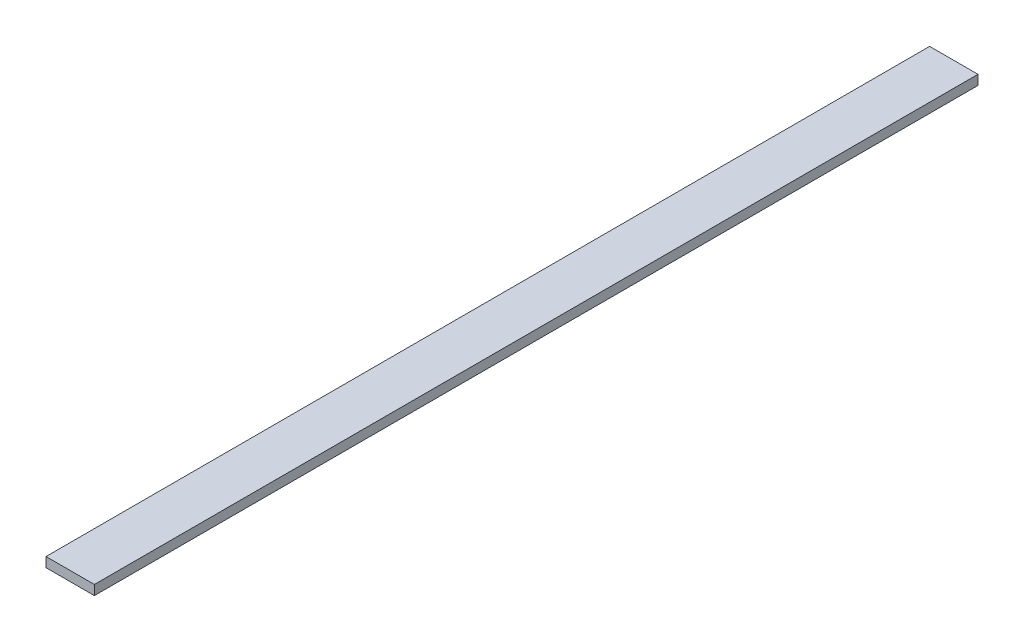
ISO-10303-21;
HEADER;
FILE_DESCRIPTION(('STEP AP214'),'2;1');
FILE_NAME('part.step','',(''),(''),'','','');
FILE_SCHEMA(('AUTOMOTIVE_DESIGN { 1 0 10303 214 1 1 1 1 }'));
ENDSEC;
DATA;
#1=APPLICATION_CONTEXT('core data for automotive mechanical design processes');
#2=APPLICATION_PROTOCOL_DEFINITION('international standard','automotive_design',2000,#1);
#3=PRODUCT_CONTEXT('',#1,'mechanical');
#4=PRODUCT('Part','Part','',(#3));
#5=PRODUCT_RELATED_PRODUCT_CATEGORY('part','',(#4));
#6=PRODUCT_DEFINITION_FORMATION('','',#4);
#7=PRODUCT_DEFINITION_CONTEXT('part definition',#1,'design');
#8=PRODUCT_DEFINITION('design','',#6,#7);
#9=PRODUCT_DEFINITION_SHAPE('','',#8);
#10=(LENGTH_UNIT() NAMED_UNIT(*) SI_UNIT(.MILLI.,.METRE.));
#11=(NAMED_UNIT(*) PLANE_ANGLE_UNIT() SI_UNIT($,.RADIAN.));
#12=(NAMED_UNIT(*) SI_UNIT($,.STERADIAN.) SOLID_ANGLE_UNIT());
#13=UNCERTAINTY_MEASURE_WITH_UNIT(LENGTH_MEASURE(1.E-05),#10,'distance_accuracy_value','');
#14=(GEOMETRIC_REPRESENTATION_CONTEXT(3) GLOBAL_UNCERTAINTY_ASSIGNED_CONTEXT((#13)) GLOBAL_UNIT_ASSIGNED_CONTEXT((#10,
#11,#12)) REPRESENTATION_CONTEXT('',''));
#15=CARTESIAN_POINT('',(0.,0.,0.));
#16=DIRECTION('',(0.,0.,1.));
#17=DIRECTION('',(1.,0.,0.));
#18=AXIS2_PLACEMENT_3D('',#15,#16,#17);
#19=CARTESIAN_POINT('',(0.,2.,-91.3239306016656));
#20=DIRECTION('',(-1.,0.,0.));
#21=DIRECTION('',(0.,0.,1.));
#22=AXIS2_PLACEMENT_3D('',#19,#20,#21);
#23=PLANE('',#22);
#24=DIRECTION('',(0.,0.,-1.));
#25=VECTOR('',#24,1.);
#26=CARTESIAN_POINT('',(0.,0.,-91.3239306016656));
#27=LINE('',#26,#25);
#28=CARTESIAN_POINT('',(0.,0.,91.3239306016656));
#29=VERTEX_POINT('',#28);
#30=CARTESIAN_POINT('',(0.,0.,-91.3239306016656));
#31=VERTEX_POINT('',#30);
#32=EDGE_CURVE('E95',#29,#31,#27,.T.);
#33=ORIENTED_EDGE('',*,*,#32,.T.);
#34=DIRECTION('',(0.,-1.,0.));
#35=VECTOR('',#34,1.);
#36=CARTESIAN_POINT('',(0.,2.,-91.3239306016656));
#37=LINE('',#36,#35);
#38=CARTESIAN_POINT('',(0.,2.,-91.3239306016656));
#39=VERTEX_POINT('',#38);
#40=EDGE_CURVE('E11',#39,#31,#37,.T.);
#41=ORIENTED_EDGE('',*,*,#40,.F.);
#42=DIRECTION('',(0.,0.,-1.));
#43=VECTOR('',#42,1.);
#44=CARTESIAN_POINT('',(0.,2.,-91.3239306016656));
#45=LINE('',#44,#43);
#46=CARTESIAN_POINT('',(0.,2.,91.3239306016656));
#47=VERTEX_POINT('',#46);
#48=EDGE_CURVE('E83',#47,#39,#45,.T.);
#49=ORIENTED_EDGE('',*,*,#48,.F.);
#50=DIRECTION('',(0.,-1.,0.));
#51=VECTOR('',#50,1.);
#52=CARTESIAN_POINT('',(0.,2.,91.3239306016656));
#53=LINE('',#52,#51);
#54=EDGE_CURVE('E91',#47,#29,#53,.T.);
#55=ORIENTED_EDGE('',*,*,#54,.T.);
#56=EDGE_LOOP('',(#33,#41,#49,#55));
#57=FACE_BOUND('',#56,.T.);
#58=ADVANCED_FACE('F32',(#57),#23,.F.);
#59=CARTESIAN_POINT('',(0.,2.,-91.3239306016656));
#60=DIRECTION('',(0.,0.,1.));
#61=DIRECTION('',(1.,0.,0.));
#62=AXIS2_PLACEMENT_3D('',#59,#60,#61);
#63=PLANE('',#62);
#64=DIRECTION('',(-1.,0.,0.));
#65=VECTOR('',#64,1.);
#66=CARTESIAN_POINT('',(0.,0.,-91.3239306016656));
#67=LINE('',#66,#65);
#68=CARTESIAN_POINT('',(-9.99999999999999,0.,-91.3239306016656));
#69=VERTEX_POINT('',#68);
#70=EDGE_CURVE('E87',#31,#69,#67,.T.);
#71=ORIENTED_EDGE('',*,*,#70,.T.);
#72=DIRECTION('',(0.,-1.,0.));
#73=VECTOR('',#72,1.);
#74=CARTESIAN_POINT('',(-9.99999999999999,2.,-91.3239306016656));
#75=LINE('',#74,#73);
#76=CARTESIAN_POINT('',(-9.99999999999999,2.,-91.3239306016656));
#77=VERTEX_POINT('',#76);
#78=EDGE_CURVE('E40',#77,#69,#75,.T.);
#79=ORIENTED_EDGE('',*,*,#78,.F.);
#80=DIRECTION('',(-1.,0.,0.));
#81=VECTOR('',#80,1.);
#82=CARTESIAN_POINT('',(0.,2.,-91.3239306016656));
#83=LINE('',#82,#81);
#84=EDGE_CURVE('E78',#39,#77,#83,.T.);
#85=ORIENTED_EDGE('',*,*,#84,.F.);
#86=ORIENTED_EDGE('',*,*,#40,.T.);
#87=EDGE_LOOP('',(#71,#79,#85,#86));
#88=FACE_BOUND('',#87,.T.);
#89=ADVANCED_FACE('F86',(#88),#63,.F.);
#90=CARTESIAN_POINT('',(-9.99999999999999,2.,-91.3239306016656));
#91=DIRECTION('',(1.,0.,0.));
#92=DIRECTION('',(0.,0.,-1.));
#93=AXIS2_PLACEMENT_3D('',#90,#91,#92);
#94=PLANE('',#93);
#95=DIRECTION('',(0.,0.,1.));
#96=VECTOR('',#95,1.);
#97=CARTESIAN_POINT('',(-9.99999999999999,0.,-91.3239306016656));
#98=LINE('',#97,#96);
#99=CARTESIAN_POINT('',(-9.99999999999999,0.,91.3239306016656));
#100=VERTEX_POINT('',#99);
#101=EDGE_CURVE('E65',#69,#100,#98,.T.);
#102=ORIENTED_EDGE('',*,*,#101,.T.);
#103=DIRECTION('',(0.,-1.,0.));
#104=VECTOR('',#103,1.);
#105=CARTESIAN_POINT('',(-9.99999999999999,2.,91.3239306016656));
#106=LINE('',#105,#104);
#107=CARTESIAN_POINT('',(-9.99999999999999,2.,91.3239306016656));
#108=VERTEX_POINT('',#107);
#109=EDGE_CURVE('E88',#108,#100,#106,.T.);
#110=ORIENTED_EDGE('',*,*,#109,.F.);
#111=DIRECTION('',(0.,0.,1.));
#112=VECTOR('',#111,1.);
#113=CARTESIAN_POINT('',(-9.99999999999999,2.,-91.3239306016656));
#114=LINE('',#113,#112);
#115=EDGE_CURVE('E81',#77,#108,#114,.T.);
#116=ORIENTED_EDGE('',*,*,#115,.F.);
#117=ORIENTED_EDGE('',*,*,#78,.T.);
#118=EDGE_LOOP('',(#102,#110,#116,#117));
#119=FACE_BOUND('',#118,.T.);
#120=ADVANCED_FACE('F89',(#119),#94,.F.);
#121=CARTESIAN_POINT('',(0.,2.,91.3239306016656));
#122=DIRECTION('',(0.,0.,-1.));
#123=DIRECTION('',(-1.,0.,0.));
#124=AXIS2_PLACEMENT_3D('',#121,#122,#123);
#125=PLANE('',#124);
#126=DIRECTION('',(1.,0.,0.));
#127=VECTOR('',#126,1.);
#128=CARTESIAN_POINT('',(0.,0.,91.3239306016656));
#129=LINE('',#128,#127);
#130=EDGE_CURVE('E71',#100,#29,#129,.T.);
#131=ORIENTED_EDGE('',*,*,#130,.T.);
#132=ORIENTED_EDGE('',*,*,#54,.F.);
#133=DIRECTION('',(1.,0.,0.));
#134=VECTOR('',#133,1.);
#135=CARTESIAN_POINT('',(0.,2.,91.3239306016656));
#136=LINE('',#135,#134);
#137=EDGE_CURVE('E48',#108,#47,#136,.T.);
#138=ORIENTED_EDGE('',*,*,#137,.F.);
#139=ORIENTED_EDGE('',*,*,#109,.T.);
#140=EDGE_LOOP('',(#131,#132,#138,#139));
#141=FACE_BOUND('',#140,.T.);
#142=ADVANCED_FACE('F102',(#141),#125,.F.);
#143=CARTESIAN_POINT('',(0.,2.,0.));
#144=DIRECTION('',(0.,-1.,0.));
#145=DIRECTION('',(0.,0.,-1.));
#146=AXIS2_PLACEMENT_3D('',#143,#144,#145);
#147=PLANE('',#146);
#148=ORIENTED_EDGE('',*,*,#48,.T.);
#149=ORIENTED_EDGE('',*,*,#84,.T.);
#150=ORIENTED_EDGE('',*,*,#115,.T.);
#151=ORIENTED_EDGE('',*,*,#137,.T.);
#152=EDGE_LOOP('',(#148,#149,#150,#151));
#153=FACE_BOUND('',#152,.T.);
#154=ADVANCED_FACE('F79',(#153),#147,.F.);
#155=CARTESIAN_POINT('',(0.,0.,0.));
#156=DIRECTION('',(0.,-1.,0.));
#157=DIRECTION('',(0.,0.,-1.));
#158=AXIS2_PLACEMENT_3D('',#155,#156,#157);
#159=PLANE('',#158);
#160=ORIENTED_EDGE('',*,*,#32,.F.);
#161=ORIENTED_EDGE('',*,*,#130,.F.);
#162=ORIENTED_EDGE('',*,*,#101,.F.);
#163=ORIENTED_EDGE('',*,*,#70,.F.);
#164=EDGE_LOOP('',(#160,#161,#162,#163));
#165=FACE_BOUND('',#164,.T.);
#166=ADVANCED_FACE('F105',(#165),#159,.T.);
#167=CLOSED_SHELL('',(#58,#89,#120,#142,#154,#166));
#168=MANIFOLD_SOLID_BREP('B2',#167);
#169=ADVANCED_BREP_SHAPE_REPRESENTATION('',(#18,#168),#14);
#170=SHAPE_DEFINITION_REPRESENTATION(#9,#169);
ENDSEC;
END-ISO-10303-21;
